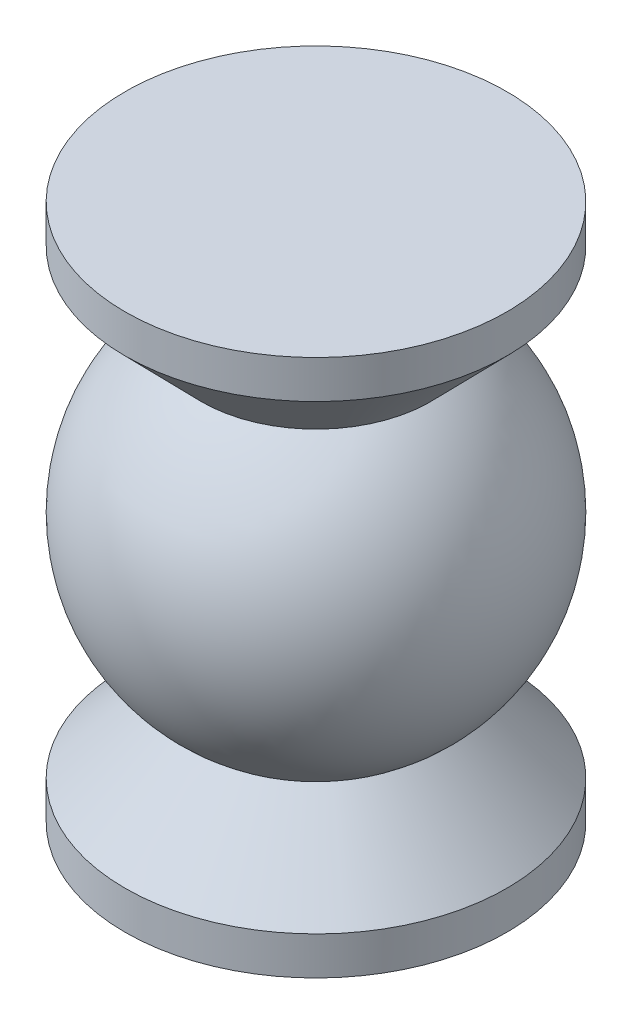
ISO-10303-21;
HEADER;
FILE_DESCRIPTION(('STEP AP214'),'2;1');
FILE_NAME('part.step','',(''),(''),'','','');
FILE_SCHEMA(('AUTOMOTIVE_DESIGN { 1 0 10303 214 1 1 1 1 }'));
ENDSEC;
DATA;
#1=APPLICATION_CONTEXT('core data for automotive mechanical design processes');
#2=APPLICATION_PROTOCOL_DEFINITION('international standard','automotive_design',2000,#1);
#3=PRODUCT_CONTEXT('',#1,'mechanical');
#4=PRODUCT('Part','Part','',(#3));
#5=PRODUCT_RELATED_PRODUCT_CATEGORY('part','',(#4));
#6=PRODUCT_DEFINITION_FORMATION('','',#4);
#7=PRODUCT_DEFINITION_CONTEXT('part definition',#1,'design');
#8=PRODUCT_DEFINITION('design','',#6,#7);
#9=PRODUCT_DEFINITION_SHAPE('','',#8);
#10=(LENGTH_UNIT() NAMED_UNIT(*) SI_UNIT(.MILLI.,.METRE.));
#11=(NAMED_UNIT(*) PLANE_ANGLE_UNIT() SI_UNIT($,.RADIAN.));
#12=(NAMED_UNIT(*) SI_UNIT($,.STERADIAN.) SOLID_ANGLE_UNIT());
#13=UNCERTAINTY_MEASURE_WITH_UNIT(LENGTH_MEASURE(1.E-05),#10,'distance_accuracy_value','');
#14=(GEOMETRIC_REPRESENTATION_CONTEXT(3) GLOBAL_UNCERTAINTY_ASSIGNED_CONTEXT((#13)) GLOBAL_UNIT_ASSIGNED_CONTEXT((#10,
#11,#12)) REPRESENTATION_CONTEXT('',''));
#15=CARTESIAN_POINT('',(0.,0.,0.));
#16=DIRECTION('',(0.,0.,1.));
#17=DIRECTION('',(1.,0.,0.));
#18=AXIS2_PLACEMENT_3D('',#15,#16,#17);
#19=CARTESIAN_POINT('',(0.,19.6168748652788,0.));
#20=DIRECTION('',(0.,1.,0.));
#21=DIRECTION('',(0.,0.,1.));
#22=AXIS2_PLACEMENT_3D('',#19,#20,#21);
#23=PLANE('',#22);
#24=CARTESIAN_POINT('',(0.,19.6168748652788,0.));
#25=DIRECTION('',(0.,1.,0.));
#26=DIRECTION('',(0.,0.,1.));
#27=AXIS2_PLACEMENT_3D('',#24,#25,#26);
#28=CIRCLE('',#27,25.);
#29=CARTESIAN_POINT('',(0.,19.6168748652788,25.));
#30=VERTEX_POINT('',#29);
#31=EDGE_CURVE('E10',#30,#30,#28,.T.);
#32=ORIENTED_EDGE('',*,*,#31,.T.);
#33=EDGE_LOOP('',(#32));
#34=FACE_BOUND('',#33,.T.);
#35=ADVANCED_FACE('F34',(#34),#23,.T.);
#36=CARTESIAN_POINT('',(0.,19.6168748652788,0.));
#37=DIRECTION('',(0.,1.,0.));
#38=DIRECTION('',(0.,0.,1.));
#39=AXIS2_PLACEMENT_3D('',#36,#37,#38);
#40=CYLINDRICAL_SURFACE('',#39,25.);
#41=CARTESIAN_POINT('',(0.,14.6168748652788,0.));
#42=DIRECTION('',(0.,1.,0.));
#43=DIRECTION('',(0.,0.,1.));
#44=AXIS2_PLACEMENT_3D('',#41,#42,#43);
#45=CIRCLE('',#44,25.);
#46=CARTESIAN_POINT('',(0.,14.6168748652788,25.));
#47=VERTEX_POINT('',#46);
#48=EDGE_CURVE('E40',#47,#47,#45,.T.);
#49=ORIENTED_EDGE('',*,*,#48,.T.);
#50=EDGE_LOOP('',(#49));
#51=FACE_BOUND('',#50,.T.);
#52=ORIENTED_EDGE('',*,*,#31,.F.);
#53=EDGE_LOOP('',(#52));
#54=FACE_BOUND('',#53,.T.);
#55=ADVANCED_FACE('F72',(#51,#54),#40,.T.);
#56=CARTESIAN_POINT('',(0.,14.6168748652788,0.));
#57=DIRECTION('',(0.,1.,0.));
#58=DIRECTION('',(0.,0.,1.));
#59=AXIS2_PLACEMENT_3D('',#56,#57,#58);
#60=CONICAL_SURFACE('',#59,25.,0.775497496809459);
#61=CARTESIAN_POINT('',(0.,4.41687486527879,0.));
#62=DIRECTION('',(0.,1.,0.));
#63=DIRECTION('',(0.,0.,1.));
#64=AXIS2_PLACEMENT_3D('',#61,#62,#63);
#65=CIRCLE('',#64,15.);
#66=CARTESIAN_POINT('',(-15.,4.41687486527879,0.));
#67=VERTEX_POINT('',#66);
#68=EDGE_CURVE('E44',#67,#67,#65,.T.);
#69=ORIENTED_EDGE('',*,*,#68,.T.);
#70=EDGE_LOOP('',(#69));
#71=FACE_BOUND('',#70,.T.);
#72=ORIENTED_EDGE('',*,*,#48,.F.);
#73=EDGE_LOOP('',(#72));
#74=FACE_BOUND('',#73,.T.);
#75=ADVANCED_FACE('F76',(#71,#74),#60,.T.);
#76=CARTESIAN_POINT('',(0.,-15.5831251347212,0.));
#77=DIRECTION('',(0.,1.,0.));
#78=DIRECTION('',(-1.,0.,0.));
#79=AXIS2_PLACEMENT_3D('',#76,#77,#78);
#80=SPHERICAL_SURFACE('',#79,25.);
#81=CARTESIAN_POINT('',(0.,-35.5831251347212,0.));
#82=DIRECTION('',(0.,1.,0.));
#83=DIRECTION('',(0.,0.,1.));
#84=AXIS2_PLACEMENT_3D('',#81,#82,#83);
#85=CIRCLE('',#84,15.);
#86=CARTESIAN_POINT('',(-15.,-35.5831251347212,0.));
#87=VERTEX_POINT('',#86);
#88=EDGE_CURVE('E48',#87,#87,#85,.T.);
#89=CARTESIAN_POINT('',(-15.,-35.5831251347212,0.));
#90=CARTESIAN_POINT('',(-15.386383877575,-35.293358293254,0.));
#91=CARTESIAN_POINT('',(-15.764349304277,-34.9923696734276,0.));
#92=CARTESIAN_POINT('',(-16.5022218904126,-34.3690161938632,0.));
#93=CARTESIAN_POINT('',(-16.8621290498462,-34.0466513341253,0.));
#94=CARTESIAN_POINT('',(-17.5626637359227,-33.3816126915451,0.));
#95=CARTESIAN_POINT('',(-17.9032912625656,-33.0389389087029,0.));
#96=CARTESIAN_POINT('',(-18.5641263057405,-32.3344371666122,0.));
#97=CARTESIAN_POINT('',(-18.8843338222726,-31.9726092073637,0.));
#98=CARTESIAN_POINT('',(-19.5032526836538,-31.2310130243671,0.));
#99=CARTESIAN_POINT('',(-19.8019640285029,-30.8512448006189,0.));
#100=CARTESIAN_POINT('',(-20.3768877346254,-30.0750436239831,0.));
#101=CARTESIAN_POINT('',(-20.6531000958988,-29.6786106710954,0.));
#102=CARTESIAN_POINT('',(-21.1820982609088,-28.8704111608927,0.));
#103=CARTESIAN_POINT('',(-21.4348840646454,-28.4586446035777,0.));
#104=CARTESIAN_POINT('',(-21.9161802896365,-27.6211605978874,0.));
#105=CARTESIAN_POINT('',(-22.1446907108911,-27.1954431495121,0.));
#106=CARTESIAN_POINT('',(-22.5766688391047,-26.3314868949282,0.));
#107=CARTESIAN_POINT('',(-22.7801365460637,-25.8932480887195,0.));
#108=CARTESIAN_POINT('',(-23.1613460121235,-25.0057207049348,0.));
#109=CARTESIAN_POINT('',(-23.3390877712243,-24.5564321273588,0.));
#110=CARTESIAN_POINT('',(-23.6682484928968,-23.6483138900022,0.));
#111=CARTESIAN_POINT('',(-23.8196674554685,-23.1894842302216,0.));
#112=CARTESIAN_POINT('',(-24.0956741265362,-22.2638245566277,0.));
#113=CARTESIAN_POINT('',(-24.2202618350321,-21.7969945428143,0.));
#114=CARTESIAN_POINT('',(-24.4421876383544,-20.8569017539961,0.));
#115=CARTESIAN_POINT('',(-24.5395257331807,-20.3836389789912,0.));
#116=CARTESIAN_POINT('',(-24.7066254525011,-19.4322698615724,0.));
#117=CARTESIAN_POINT('',(-24.776387076995,-18.9541635191585,0.));
#118=CARTESIAN_POINT('',(-24.8880995994487,-17.9947127251622,0.));
#119=CARTESIAN_POINT('',(-24.9300504974084,-17.5133682735798,0.));
#120=CARTESIAN_POINT('',(-24.9860006976841,-16.5490575929053,0.));
#121=CARTESIAN_POINT('',(-25.,-16.0660913638132,0.));
#122=CARTESIAN_POINT('',(-25.,-15.1001589056292,0.));
#123=CARTESIAN_POINT('',(-24.9860006976841,-14.6171926765371,0.));
#124=CARTESIAN_POINT('',(-24.9300504974084,-13.6528819958627,0.));
#125=CARTESIAN_POINT('',(-24.8880995994487,-13.1715375442802,0.));
#126=CARTESIAN_POINT('',(-24.7763870769951,-12.2120867502839,0.));
#127=CARTESIAN_POINT('',(-24.7066254525011,-11.73398040787,0.));
#128=CARTESIAN_POINT('',(-24.5395257331807,-10.7826112904512,0.));
#129=CARTESIAN_POINT('',(-24.4421876383544,-10.3093485154463,0.));
#130=CARTESIAN_POINT('',(-24.2202618350321,-9.36925572662806,0.));
#131=CARTESIAN_POINT('',(-24.0956741265362,-8.9024257128147,0.));
#132=CARTESIAN_POINT('',(-23.8196674554685,-7.97676603922077,0.));
#133=CARTESIAN_POINT('',(-23.6682484928968,-7.51793637944019,0.));
#134=CARTESIAN_POINT('',(-23.3390877712243,-6.6098181420836,0.));
#135=CARTESIAN_POINT('',(-23.1613460121235,-6.16052956450758,0.));
#136=CARTESIAN_POINT('',(-22.7801365460637,-5.2730021807229,0.));
#137=CARTESIAN_POINT('',(-22.5766688391047,-4.83476337451422,0.));
#138=CARTESIAN_POINT('',(-22.1446907108911,-3.97080711993029,0.));
#139=CARTESIAN_POINT('',(-21.9161802896365,-3.54508967155504,0.));
#140=CARTESIAN_POINT('',(-21.4348840646454,-2.70760566586474,0.));
#141=CARTESIAN_POINT('',(-21.1820982609088,-2.29583910854969,0.));
#142=CARTESIAN_POINT('',(-20.6531000958988,-1.48763959834698,0.));
#143=CARTESIAN_POINT('',(-20.3768877346255,-1.09120664545932,0.));
#144=CARTESIAN_POINT('',(-19.8019640285029,-0.315005468823497,0.));
#145=CARTESIAN_POINT('',(-19.5032526836538,0.0647627549246584,0.));
#146=CARTESIAN_POINT('',(-18.8843338222726,0.806358937921293,0.));
#147=CARTESIAN_POINT('',(-18.5641263057405,1.16818689716977,0.));
#148=CARTESIAN_POINT('',(-17.9032912625656,1.87268863926049,0.));
#149=CARTESIAN_POINT('',(-17.5626637359227,2.21536242210273,0.));
#150=CARTESIAN_POINT('',(-16.8621290498462,2.8804010646829,0.));
#151=CARTESIAN_POINT('',(-16.5022218904126,3.20276592442081,0.));
#152=CARTESIAN_POINT('',(-15.764349304277,3.82611940398519,0.));
#153=CARTESIAN_POINT('',(-15.386383877575,4.12710802381164,0.));
#154=CARTESIAN_POINT('',(-15.,4.41687486527879,0.));
#155=B_SPLINE_CURVE_WITH_KNOTS('',3,(#89,#90,#91,#92,#93,#94,#95,#96,#97,#98,#99,#100,#101,#102,
#103,#104,#105,#106,#107,#108,#109,#110,#111,#112,#113,#114,#115,#116,#117,#118,#119,#120,#121,
#122,#123,#124,#125,#126,#127,#128,#129,#130,#131,#132,#133,#134,#135,#136,#137,#138,#139,#140,
#141,#142,#143,#144,#145,#146,#147,#148,#149,#150,#151,#152,#153,#154),.UNSPECIFIED.,.F.,.F.,(4,
2,2,2,2,2,2,2,2,2,2,2,2,2,2,2,2,2,2,2,2,2,2,2,2,2,2,2,2,2,2,2,4),(0.,1.4486960076868,
2.89739201537359,4.34608802306039,5.79478403074718,7.24348003843398,8.69217604612078,
10.1408720538076,11.5895680614944,13.0382640691812,14.486960076868,15.9356560845548,
17.3843520922416,18.8330480999284,20.2817441076151,21.7304401153019,23.1791361229887,
24.6278321306755,26.0765281383623,27.5252241460491,28.9739201537359,30.4226161614227,
31.8713121691095,33.3200081767963,34.7687041844831,36.2174001921699,37.6660961998567,
39.1147922075435,40.5634882152303,42.0121842229171,43.4608802306039,44.9095762382907,
46.3582722459775),.UNSPECIFIED.);
#156=EDGE_CURVE('BSEAM80',#87,#67,#155,.T.);
#157=ORIENTED_EDGE('',*,*,#88,.T.);
#158=ORIENTED_EDGE('',*,*,#68,.F.);
#159=ORIENTED_EDGE('',*,*,#156,.T.);
#160=ORIENTED_EDGE('',*,*,#156,.F.);
#161=EDGE_LOOP('',(#157,#159,#158,#160));
#162=FACE_BOUND('',#161,.T.);
#163=ADVANCED_FACE('F80',(#162),#80,.T.);
#164=CARTESIAN_POINT('',(0.,-35.5831251347212,0.));
#165=DIRECTION('',(0.,-1.,0.));
#166=DIRECTION('',(0.,0.,-1.));
#167=AXIS2_PLACEMENT_3D('',#164,#165,#166);
#168=CONICAL_SURFACE('',#167,15.,0.775497496809459);
#169=CARTESIAN_POINT('',(0.,-45.7831251347212,0.));
#170=DIRECTION('',(0.,1.,0.));
#171=DIRECTION('',(0.,0.,1.));
#172=AXIS2_PLACEMENT_3D('',#169,#170,#171);
#173=CIRCLE('',#172,25.);
#174=CARTESIAN_POINT('',(0.,-45.7831251347212,25.));
#175=VERTEX_POINT('',#174);
#176=EDGE_CURVE('E53',#175,#175,#173,.T.);
#177=ORIENTED_EDGE('',*,*,#176,.T.);
#178=EDGE_LOOP('',(#177));
#179=FACE_BOUND('',#178,.T.);
#180=ORIENTED_EDGE('',*,*,#88,.F.);
#181=EDGE_LOOP('',(#180));
#182=FACE_BOUND('',#181,.T.);
#183=ADVANCED_FACE('F69',(#179,#182),#168,.T.);
#184=CARTESIAN_POINT('',(0.,19.6168748652788,0.));
#185=DIRECTION('',(0.,1.,0.));
#186=DIRECTION('',(0.,0.,1.));
#187=AXIS2_PLACEMENT_3D('',#184,#185,#186);
#188=CYLINDRICAL_SURFACE('',#187,25.);
#189=CARTESIAN_POINT('',(0.,-50.7831251347212,0.));
#190=DIRECTION('',(0.,1.,0.));
#191=DIRECTION('',(0.,0.,1.));
#192=AXIS2_PLACEMENT_3D('',#189,#190,#191);
#193=CIRCLE('',#192,25.);
#194=CARTESIAN_POINT('',(0.,-50.7831251347212,25.));
#195=VERTEX_POINT('',#194);
#196=EDGE_CURVE('E56',#195,#195,#193,.T.);
#197=ORIENTED_EDGE('',*,*,#196,.T.);
#198=EDGE_LOOP('',(#197));
#199=FACE_BOUND('',#198,.T.);
#200=ORIENTED_EDGE('',*,*,#176,.F.);
#201=EDGE_LOOP('',(#200));
#202=FACE_BOUND('',#201,.T.);
#203=ADVANCED_FACE('F60',(#199,#202),#188,.T.);
#204=CARTESIAN_POINT('',(0.,-50.7831251347212,0.));
#205=DIRECTION('',(0.,-1.,0.));
#206=DIRECTION('',(0.,0.,-1.));
#207=AXIS2_PLACEMENT_3D('',#204,#205,#206);
#208=PLANE('',#207);
#209=ORIENTED_EDGE('',*,*,#196,.F.);
#210=EDGE_LOOP('',(#209));
#211=FACE_BOUND('',#210,.T.);
#212=ADVANCED_FACE('F63',(#211),#208,.T.);
#213=CLOSED_SHELL('',(#35,#55,#75,#163,#183,#203,#212));
#214=MANIFOLD_SOLID_BREP('B2',#213);
#215=ADVANCED_BREP_SHAPE_REPRESENTATION('',(#18,#214),#14);
#216=SHAPE_DEFINITION_REPRESENTATION(#9,#215);
ENDSEC;
END-ISO-10303-21;
